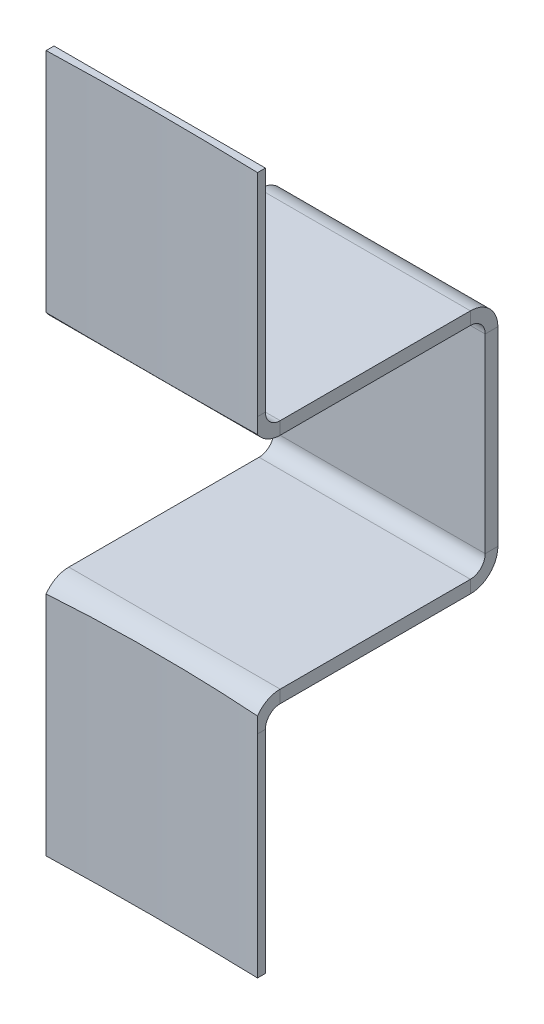
ISO-10303-21;
HEADER;
FILE_DESCRIPTION(('STEP AP214'),'2;1');
FILE_NAME('part.step','',(''),(''),'','','');
FILE_SCHEMA(('AUTOMOTIVE_DESIGN { 1 0 10303 214 1 1 1 1 }'));
ENDSEC;
DATA;
#1=APPLICATION_CONTEXT('core data for automotive mechanical design processes');
#2=APPLICATION_PROTOCOL_DEFINITION('international standard','automotive_design',2000,#1);
#3=PRODUCT_CONTEXT('',#1,'mechanical');
#4=PRODUCT('Part','Part','',(#3));
#5=PRODUCT_RELATED_PRODUCT_CATEGORY('part','',(#4));
#6=PRODUCT_DEFINITION_FORMATION('','',#4);
#7=PRODUCT_DEFINITION_CONTEXT('part definition',#1,'design');
#8=PRODUCT_DEFINITION('design','',#6,#7);
#9=PRODUCT_DEFINITION_SHAPE('','',#8);
#10=(LENGTH_UNIT() NAMED_UNIT(*) SI_UNIT(.MILLI.,.METRE.));
#11=(NAMED_UNIT(*) PLANE_ANGLE_UNIT() SI_UNIT($,.RADIAN.));
#12=(NAMED_UNIT(*) SI_UNIT($,.STERADIAN.) SOLID_ANGLE_UNIT());
#13=UNCERTAINTY_MEASURE_WITH_UNIT(LENGTH_MEASURE(1.E-05),#10,'distance_accuracy_value','');
#14=(GEOMETRIC_REPRESENTATION_CONTEXT(3) GLOBAL_UNCERTAINTY_ASSIGNED_CONTEXT((#13)) GLOBAL_UNIT_ASSIGNED_CONTEXT((#10,
#11,#12)) REPRESENTATION_CONTEXT('',''));
#15=CARTESIAN_POINT('',(0.,0.,0.));
#16=DIRECTION('',(0.,0.,1.));
#17=DIRECTION('',(1.,0.,0.));
#18=AXIS2_PLACEMENT_3D('',#15,#16,#17);
#19=CARTESIAN_POINT('',(0.,0.,0.));
#20=DIRECTION('',(0.,1.,0.));
#21=DIRECTION('',(0.,0.,1.));
#22=AXIS2_PLACEMENT_3D('',#19,#20,#21);
#23=PLANE('',#22);
#24=CARTESIAN_POINT('',(0.,0.,169.599));
#25=DIRECTION('',(0.,1.,0.));
#26=DIRECTION('',(0.,0.,1.));
#27=AXIS2_PLACEMENT_3D('',#24,#25,#26);
#28=CIRCLE('',#27,169.6);
#29=CARTESIAN_POINT('',(5.,0.,0.0727188516187749));
#30=VERTEX_POINT('',#29);
#31=CARTESIAN_POINT('',(-5.,0.,0.0727188516187749));
#32=VERTEX_POINT('',#31);
#33=EDGE_CURVE('E209',#30,#32,#28,.T.);
#34=ORIENTED_EDGE('',*,*,#33,.F.);
#35=DIRECTION('',(0.,0.,-1.));
#36=VECTOR('',#35,1.);
#37=CARTESIAN_POINT('',(5.,0.,-0.3));
#38=LINE('',#37,#36);
#39=CARTESIAN_POINT('',(5.,0.,-0.3));
#40=VERTEX_POINT('',#39);
#41=EDGE_CURVE('E290',#30,#40,#38,.T.);
#42=ORIENTED_EDGE('',*,*,#41,.T.);
#43=DIRECTION('',(-1.,0.,0.));
#44=VECTOR('',#43,1.);
#45=CARTESIAN_POINT('',(-5.,0.,-0.3));
#46=LINE('',#45,#44);
#47=CARTESIAN_POINT('',(-5.,0.,-0.3));
#48=VERTEX_POINT('',#47);
#49=EDGE_CURVE('E293',#40,#48,#46,.T.);
#50=ORIENTED_EDGE('',*,*,#49,.T.);
#51=DIRECTION('',(0.,0.,1.));
#52=VECTOR('',#51,1.);
#53=CARTESIAN_POINT('',(-5.,0.,-0.3));
#54=LINE('',#53,#52);
#55=EDGE_CURVE('E294',#48,#32,#54,.T.);
#56=ORIENTED_EDGE('',*,*,#55,.T.);
#57=EDGE_LOOP('',(#34,#42,#50,#56));
#58=FACE_BOUND('',#57,.T.);
#59=ADVANCED_FACE('F42',(#58),#23,.T.);
#60=CARTESIAN_POINT('',(0.,-33.,0.));
#61=DIRECTION('',(0.,1.,0.));
#62=DIRECTION('',(0.,0.,1.));
#63=AXIS2_PLACEMENT_3D('',#60,#61,#62);
#64=PLANE('',#63);
#65=DIRECTION('',(0.,0.,-1.));
#66=VECTOR('',#65,1.);
#67=CARTESIAN_POINT('',(5.,-33.,-0.300000000000001));
#68=LINE('',#67,#66);
#69=CARTESIAN_POINT('',(5.,-33.,0.0727188516187749));
#70=VERTEX_POINT('',#69);
#71=CARTESIAN_POINT('',(5.,-33.,-0.300000000000001));
#72=VERTEX_POINT('',#71);
#73=EDGE_CURVE('E206',#70,#72,#68,.T.);
#74=ORIENTED_EDGE('',*,*,#73,.F.);
#75=CARTESIAN_POINT('',(0.,-33.,169.599));
#76=DIRECTION('',(0.,1.,0.));
#77=DIRECTION('',(0.,0.,1.));
#78=AXIS2_PLACEMENT_3D('',#75,#76,#77);
#79=CIRCLE('',#78,169.6);
#80=CARTESIAN_POINT('',(-5.,-33.,0.0727188516187749));
#81=VERTEX_POINT('',#80);
#82=EDGE_CURVE('E65',#70,#81,#79,.T.);
#83=ORIENTED_EDGE('',*,*,#82,.T.);
#84=DIRECTION('',(0.,0.,1.));
#85=VECTOR('',#84,1.);
#86=CARTESIAN_POINT('',(-5.,-33.,-0.300000000000001));
#87=LINE('',#86,#85);
#88=CARTESIAN_POINT('',(-5.,-33.,-0.300000000000001));
#89=VERTEX_POINT('',#88);
#90=EDGE_CURVE('E204',#89,#81,#87,.T.);
#91=ORIENTED_EDGE('',*,*,#90,.F.);
#92=DIRECTION('',(-1.,0.,0.));
#93=VECTOR('',#92,1.);
#94=CARTESIAN_POINT('',(-5.,-33.,-0.300000000000001));
#95=LINE('',#94,#93);
#96=EDGE_CURVE('E50',#72,#89,#95,.T.);
#97=ORIENTED_EDGE('',*,*,#96,.F.);
#98=EDGE_LOOP('',(#74,#83,#91,#97));
#99=FACE_BOUND('',#98,.T.);
#100=ADVANCED_FACE('F202',(#99),#64,.F.);
#101=CARTESIAN_POINT('',(-5.,0.,-0.3));
#102=DIRECTION('',(1.,0.,0.));
#103=DIRECTION('',(0.,0.,-1.));
#104=AXIS2_PLACEMENT_3D('',#101,#102,#103);
#105=PLANE('',#104);
#106=DIRECTION('',(0.,0.,1.));
#107=VECTOR('',#106,1.);
#108=CARTESIAN_POINT('',(-5.,-9.99999999999999,-0.300000000000001));
#109=LINE('',#108,#107);
#110=CARTESIAN_POINT('',(-5.,-9.99999999999999,-0.300000000000001));
#111=VERTEX_POINT('',#110);
#112=CARTESIAN_POINT('',(-5.,-9.99999999999999,0.0727188516187749));
#113=VERTEX_POINT('',#112);
#114=EDGE_CURVE('E299',#111,#113,#109,.T.);
#115=ORIENTED_EDGE('',*,*,#114,.T.);
#116=DIRECTION('',(0.,1.,0.));
#117=VECTOR('',#116,1.);
#118=CARTESIAN_POINT('',(-5.,-33.,0.0727188516187749));
#119=LINE('',#118,#117);
#120=EDGE_CURVE('E609',#113,#32,#119,.T.);
#121=ORIENTED_EDGE('',*,*,#120,.T.);
#122=ORIENTED_EDGE('',*,*,#55,.F.);
#123=DIRECTION('',(0.,-1.,0.));
#124=VECTOR('',#123,1.);
#125=CARTESIAN_POINT('',(-5.,0.,-0.3));
#126=LINE('',#125,#124);
#127=EDGE_CURVE('E364',#48,#111,#126,.T.);
#128=ORIENTED_EDGE('',*,*,#127,.T.);
#129=EDGE_LOOP('',(#115,#121,#122,#128));
#130=FACE_BOUND('',#129,.T.);
#131=ADVANCED_FACE('F428',(#130),#105,.F.);
#132=CARTESIAN_POINT('',(5.,0.,-0.3));
#133=DIRECTION('',(-1.,0.,0.));
#134=DIRECTION('',(0.,0.,1.));
#135=AXIS2_PLACEMENT_3D('',#132,#133,#134);
#136=PLANE('',#135);
#137=ORIENTED_EDGE('',*,*,#41,.F.);
#138=DIRECTION('',(0.,1.,0.));
#139=VECTOR('',#138,1.);
#140=CARTESIAN_POINT('',(5.,-33.,0.0727188516187749));
#141=LINE('',#140,#139);
#142=CARTESIAN_POINT('',(5.,-9.99999999999999,0.0727188516187749));
#143=VERTEX_POINT('',#142);
#144=EDGE_CURVE('E518',#30,#143,#141,.F.);
#145=ORIENTED_EDGE('',*,*,#144,.T.);
#146=DIRECTION('',(0.,0.,-1.));
#147=VECTOR('',#146,1.);
#148=CARTESIAN_POINT('',(5.,-9.99999999999999,-0.300000000000001));
#149=LINE('',#148,#147);
#150=CARTESIAN_POINT('',(5.,-9.99999999999999,-0.300000000000001));
#151=VERTEX_POINT('',#150);
#152=EDGE_CURVE('E295',#143,#151,#149,.T.);
#153=ORIENTED_EDGE('',*,*,#152,.T.);
#154=DIRECTION('',(0.,-1.,0.));
#155=VECTOR('',#154,1.);
#156=CARTESIAN_POINT('',(5.,0.,-0.3));
#157=LINE('',#156,#155);
#158=EDGE_CURVE('E298',#40,#151,#157,.T.);
#159=ORIENTED_EDGE('',*,*,#158,.F.);
#160=EDGE_LOOP('',(#137,#145,#153,#159));
#161=FACE_BOUND('',#160,.T.);
#162=ADVANCED_FACE('F504',(#161),#136,.F.);
#163=CARTESIAN_POINT('',(-5.,0.,-0.3));
#164=DIRECTION('',(0.,0.,1.));
#165=DIRECTION('',(0.,-1.,0.));
#166=AXIS2_PLACEMENT_3D('',#163,#164,#165);
#167=PLANE('',#166);
#168=DIRECTION('',(-1.,0.,0.));
#169=VECTOR('',#168,1.);
#170=CARTESIAN_POINT('',(-5.,-9.99999999999999,-0.300000000000001));
#171=LINE('',#170,#169);
#172=EDGE_CURVE('E303',#151,#111,#171,.T.);
#173=ORIENTED_EDGE('',*,*,#172,.T.);
#174=ORIENTED_EDGE('',*,*,#127,.F.);
#175=ORIENTED_EDGE('',*,*,#49,.F.);
#176=ORIENTED_EDGE('',*,*,#158,.T.);
#177=EDGE_LOOP('',(#173,#174,#175,#176));
#178=FACE_BOUND('',#177,.T.);
#179=ADVANCED_FACE('F522',(#178),#167,.F.);
#180=CARTESIAN_POINT('',(-5.,-9.99999999999999,-0.300000000000001));
#181=DIRECTION('',(1.,0.,0.));
#182=DIRECTION('',(0.,0.,-1.));
#183=AXIS2_PLACEMENT_3D('',#180,#181,#182);
#184=PLANE('',#183);
#185=CARTESIAN_POINT('',(-5.,-10.,-1.));
#186=DIRECTION('',(1.,0.,0.));
#187=DIRECTION('',(0.,0.,1.));
#188=AXIS2_PLACEMENT_3D('',#185,#186,#187);
#189=CIRCLE('',#188,1.3);
#190=CARTESIAN_POINT('',(-5.,-10.7343529569503,0.0727188516187749));
#191=VERTEX_POINT('',#190);
#192=CARTESIAN_POINT('',(-5.,-11.3,-1.00000000000001));
#193=VERTEX_POINT('',#192);
#194=EDGE_CURVE('E230',#191,#193,#189,.T.);
#195=ORIENTED_EDGE('',*,*,#194,.F.);
#196=DIRECTION('',(0.,1.,0.));
#197=VECTOR('',#196,1.);
#198=CARTESIAN_POINT('',(-5.,-33.,0.0727188516187749));
#199=LINE('',#198,#197);
#200=EDGE_CURVE('E440',#191,#113,#199,.T.);
#201=ORIENTED_EDGE('',*,*,#200,.T.);
#202=ORIENTED_EDGE('',*,*,#114,.F.);
#203=CARTESIAN_POINT('',(-5.,-10.,-1.));
#204=DIRECTION('',(1.,0.,0.));
#205=DIRECTION('',(0.,0.,1.));
#206=AXIS2_PLACEMENT_3D('',#203,#204,#205);
#207=CIRCLE('',#206,0.700000000000001);
#208=CARTESIAN_POINT('',(-5.,-10.7,-1.00000000000001));
#209=VERTEX_POINT('',#208);
#210=EDGE_CURVE('E368',#111,#209,#207,.T.);
#211=ORIENTED_EDGE('',*,*,#210,.T.);
#212=DIRECTION('',(0.,-1.,0.));
#213=VECTOR('',#212,1.);
#214=CARTESIAN_POINT('',(-5.,-10.7,-1.00000000000001));
#215=LINE('',#214,#213);
#216=EDGE_CURVE('E534',#209,#193,#215,.T.);
#217=ORIENTED_EDGE('',*,*,#216,.T.);
#218=EDGE_LOOP('',(#195,#201,#202,#211,#217));
#219=FACE_BOUND('',#218,.T.);
#220=ADVANCED_FACE('F448',(#219),#184,.F.);
#221=CARTESIAN_POINT('',(0.,-10.,-1.));
#222=DIRECTION('',(1.,0.,0.));
#223=DIRECTION('',(0.,0.,-1.));
#224=AXIS2_PLACEMENT_3D('',#221,#222,#223);
#225=CYLINDRICAL_SURFACE('',#224,1.3);
#226=CARTESIAN_POINT('',(5.,-10.,-1.));
#227=DIRECTION('',(1.,0.,0.));
#228=DIRECTION('',(0.,0.,1.));
#229=AXIS2_PLACEMENT_3D('',#226,#227,#228);
#230=CIRCLE('',#229,1.3);
#231=CARTESIAN_POINT('',(5.,-10.7343529569503,0.0727188516187749));
#232=VERTEX_POINT('',#231);
#233=CARTESIAN_POINT('',(5.,-11.3,-1.00000000000001));
#234=VERTEX_POINT('',#233);
#235=EDGE_CURVE('E229',#232,#234,#230,.T.);
#236=ORIENTED_EDGE('',*,*,#235,.F.);
#237=CARTESIAN_POINT('',(5.,-10.7343529569503,0.0727188516187749));
#238=CARTESIAN_POINT('',(4.56710657150074,-10.7529223545076,0.0599507829004519));
#239=CARTESIAN_POINT('',(4.13403927755849,-10.7682262464902,0.0488378920569281));
#240=CARTESIAN_POINT('',(3.48433641418812,-10.7871174579659,0.0346573580335505));
#241=CARTESIAN_POINT('',(3.26778670418943,-10.7927365126097,0.0303458080338849));
#242=CARTESIAN_POINT('',(2.83464152802516,-10.8027605156565,0.0225519574346682));
#243=CARTESIAN_POINT('',(2.6180460611939,-10.807165444975,0.0190696698702353));
#244=CARTESIAN_POINT('',(1.78491533421112,-10.8219574039432,0.00727192238790079));
#245=CARTESIAN_POINT('',(1.16826225589085,-10.8283747085537,0.00190258279581291));
#246=CARTESIAN_POINT('',(-0.0651044875729709,-10.8331981860363,-0.00210871445944375));
#247=CARTESIAN_POINT('',(-0.681818153598923,-10.8316042164473,-0.000750552490463859));
#248=CARTESIAN_POINT('',(-1.60707138051038,-10.8229836608874,0.0063333804057084));
#249=CARTESIAN_POINT('',(-1.91566258517029,-10.8190686160109,0.00953846242033991));
#250=CARTESIAN_POINT('',(-2.53278542991408,-10.8089910077911,0.0176324407112478));
#251=CARTESIAN_POINT('',(-2.84131707032667,-10.8028284572274,0.0225213274133516));
#252=CARTESIAN_POINT('',(-3.45828794792507,-10.7880189099031,0.0339816884898349));
#253=CARTESIAN_POINT('',(-3.76672718593358,-10.7793719359627,0.040553147409192));
#254=CARTESIAN_POINT('',(-4.38347492480908,-10.7591596553084,0.05537637003732));
#255=CARTESIAN_POINT('',(-4.69178342303212,-10.7475942921546,0.0636281662421999));
#256=CARTESIAN_POINT('',(-5.,-10.7343529569504,0.0727188516187486));
#257=B_SPLINE_CURVE_WITH_KNOTS('',3,(#237,#238,#239,#240,#241,#242,#243,#244,#245,#246,#247,
#248,#249,#250,#251,#252,#253,#254,#255,#256),.UNSPECIFIED.,.F.,.F.,(4,2,2,2,2,2,2,2,2,4),(0.,
1.30040062071421,1.95039151468905,2.60039262515101,4.45041805959426,6.30047639232974,
7.22636385438622,8.15224605190095,9.07811974516451,10.0040113456367),.UNSPECIFIED.);
#258=EDGE_CURVE('E57',#232,#191,#257,.T.);
#259=ORIENTED_EDGE('',*,*,#258,.T.);
#260=ORIENTED_EDGE('',*,*,#194,.T.);
#261=DIRECTION('',(1.,0.,0.));
#262=VECTOR('',#261,1.);
#263=CARTESIAN_POINT('',(-5.,-11.3,-1.00000000000001));
#264=LINE('',#263,#262);
#265=EDGE_CURVE('E225',#193,#234,#264,.T.);
#266=ORIENTED_EDGE('',*,*,#265,.T.);
#267=EDGE_LOOP('',(#236,#259,#260,#266));
#268=FACE_BOUND('',#267,.T.);
#269=ADVANCED_FACE('F442',(#268),#225,.T.);
#270=CARTESIAN_POINT('',(5.,-9.99999999999999,-0.300000000000001));
#271=DIRECTION('',(-1.,0.,0.));
#272=DIRECTION('',(0.,0.,1.));
#273=AXIS2_PLACEMENT_3D('',#270,#271,#272);
#274=PLANE('',#273);
#275=ORIENTED_EDGE('',*,*,#152,.F.);
#276=DIRECTION('',(0.,1.,0.));
#277=VECTOR('',#276,1.);
#278=CARTESIAN_POINT('',(5.,-33.,0.0727188516187749));
#279=LINE('',#278,#277);
#280=EDGE_CURVE('E197',#143,#232,#279,.F.);
#281=ORIENTED_EDGE('',*,*,#280,.T.);
#282=ORIENTED_EDGE('',*,*,#235,.T.);
#283=DIRECTION('',(0.,1.,0.));
#284=VECTOR('',#283,1.);
#285=CARTESIAN_POINT('',(5.,-10.7,-1.00000000000001));
#286=LINE('',#285,#284);
#287=CARTESIAN_POINT('',(5.,-10.7,-1.00000000000001));
#288=VERTEX_POINT('',#287);
#289=EDGE_CURVE('E233',#234,#288,#286,.T.);
#290=ORIENTED_EDGE('',*,*,#289,.T.);
#291=CARTESIAN_POINT('',(5.,-10.,-1.));
#292=DIRECTION('',(1.,0.,0.));
#293=DIRECTION('',(0.,0.,1.));
#294=AXIS2_PLACEMENT_3D('',#291,#292,#293);
#295=CIRCLE('',#294,0.700000000000001);
#296=EDGE_CURVE('E307',#151,#288,#295,.T.);
#297=ORIENTED_EDGE('',*,*,#296,.F.);
#298=EDGE_LOOP('',(#275,#281,#282,#290,#297));
#299=FACE_BOUND('',#298,.T.);
#300=ADVANCED_FACE('F447',(#299),#274,.F.);
#301=CARTESIAN_POINT('',(0.,-10.,-1.));
#302=DIRECTION('',(1.,0.,0.));
#303=DIRECTION('',(0.,0.,-1.));
#304=AXIS2_PLACEMENT_3D('',#301,#302,#303);
#305=CYLINDRICAL_SURFACE('',#304,0.700000000000001);
#306=DIRECTION('',(-1.,0.,0.));
#307=VECTOR('',#306,1.);
#308=CARTESIAN_POINT('',(-5.,-10.7,-1.00000000000001));
#309=LINE('',#308,#307);
#310=EDGE_CURVE('E311',#288,#209,#309,.T.);
#311=ORIENTED_EDGE('',*,*,#310,.T.);
#312=ORIENTED_EDGE('',*,*,#210,.F.);
#313=ORIENTED_EDGE('',*,*,#172,.F.);
#314=ORIENTED_EDGE('',*,*,#296,.T.);
#315=EDGE_LOOP('',(#311,#312,#313,#314));
#316=FACE_BOUND('',#315,.T.);
#317=ADVANCED_FACE('F627',(#316),#305,.F.);
#318=CARTESIAN_POINT('',(-5.,-10.7,-1.00000000000001));
#319=DIRECTION('',(1.,0.,0.));
#320=DIRECTION('',(0.,0.,-1.));
#321=AXIS2_PLACEMENT_3D('',#318,#319,#320);
#322=PLANE('',#321);
#323=DIRECTION('',(0.,0.,-1.));
#324=VECTOR('',#323,1.);
#325=CARTESIAN_POINT('',(-5.,-11.3,-1.00000000000001));
#326=LINE('',#325,#324);
#327=CARTESIAN_POINT('',(-5.,-11.3,-9.99999999999999));
#328=VERTEX_POINT('',#327);
#329=EDGE_CURVE('E239',#193,#328,#326,.T.);
#330=ORIENTED_EDGE('',*,*,#329,.F.);
#331=ORIENTED_EDGE('',*,*,#216,.F.);
#332=DIRECTION('',(0.,0.,-1.));
#333=VECTOR('',#332,1.);
#334=CARTESIAN_POINT('',(-5.,-10.7,-1.00000000000001));
#335=LINE('',#334,#333);
#336=CARTESIAN_POINT('',(-5.,-10.7,-9.99999999999999));
#337=VERTEX_POINT('',#336);
#338=EDGE_CURVE('E372',#209,#337,#335,.T.);
#339=ORIENTED_EDGE('',*,*,#338,.T.);
#340=DIRECTION('',(0.,-1.,0.));
#341=VECTOR('',#340,1.);
#342=CARTESIAN_POINT('',(-5.,-10.7,-9.99999999999999));
#343=LINE('',#342,#341);
#344=EDGE_CURVE('E543',#337,#328,#343,.T.);
#345=ORIENTED_EDGE('',*,*,#344,.T.);
#346=EDGE_LOOP('',(#330,#331,#339,#345));
#347=FACE_BOUND('',#346,.T.);
#348=ADVANCED_FACE('F455',(#347),#322,.F.);
#349=CARTESIAN_POINT('',(-5.,-11.3,-1.00000000000001));
#350=DIRECTION('',(0.,1.,0.));
#351=DIRECTION('',(0.,0.,1.));
#352=AXIS2_PLACEMENT_3D('',#349,#350,#351);
#353=PLANE('',#352);
#354=DIRECTION('',(0.,0.,-1.));
#355=VECTOR('',#354,1.);
#356=CARTESIAN_POINT('',(5.,-11.3,-1.00000000000001));
#357=LINE('',#356,#355);
#358=CARTESIAN_POINT('',(5.,-11.3,-9.99999999999999));
#359=VERTEX_POINT('',#358);
#360=EDGE_CURVE('E238',#234,#359,#357,.T.);
#361=ORIENTED_EDGE('',*,*,#360,.F.);
#362=ORIENTED_EDGE('',*,*,#265,.F.);
#363=ORIENTED_EDGE('',*,*,#329,.T.);
#364=DIRECTION('',(1.,0.,0.));
#365=VECTOR('',#364,1.);
#366=CARTESIAN_POINT('',(-5.,-11.3,-9.99999999999999));
#367=LINE('',#366,#365);
#368=EDGE_CURVE('E234',#328,#359,#367,.T.);
#369=ORIENTED_EDGE('',*,*,#368,.T.);
#370=EDGE_LOOP('',(#361,#362,#363,#369));
#371=FACE_BOUND('',#370,.T.);
#372=ADVANCED_FACE('F451',(#371),#353,.F.);
#373=CARTESIAN_POINT('',(5.,-10.7,-1.00000000000001));
#374=DIRECTION('',(-1.,0.,0.));
#375=DIRECTION('',(0.,0.,1.));
#376=AXIS2_PLACEMENT_3D('',#373,#374,#375);
#377=PLANE('',#376);
#378=DIRECTION('',(0.,0.,-1.));
#379=VECTOR('',#378,1.);
#380=CARTESIAN_POINT('',(5.,-10.7,-1.00000000000001));
#381=LINE('',#380,#379);
#382=CARTESIAN_POINT('',(5.,-10.7,-9.99999999999999));
#383=VERTEX_POINT('',#382);
#384=EDGE_CURVE('E315',#288,#383,#381,.T.);
#385=ORIENTED_EDGE('',*,*,#384,.F.);
#386=ORIENTED_EDGE('',*,*,#289,.F.);
#387=ORIENTED_EDGE('',*,*,#360,.T.);
#388=DIRECTION('',(0.,1.,0.));
#389=VECTOR('',#388,1.);
#390=CARTESIAN_POINT('',(5.,-10.7,-9.99999999999999));
#391=LINE('',#390,#389);
#392=EDGE_CURVE('E243',#359,#383,#391,.T.);
#393=ORIENTED_EDGE('',*,*,#392,.T.);
#394=EDGE_LOOP('',(#385,#386,#387,#393));
#395=FACE_BOUND('',#394,.T.);
#396=ADVANCED_FACE('F454',(#395),#377,.F.);
#397=CARTESIAN_POINT('',(-5.,-10.7,-1.00000000000001));
#398=DIRECTION('',(0.,-1.,0.));
#399=DIRECTION('',(0.,0.,-1.));
#400=AXIS2_PLACEMENT_3D('',#397,#398,#399);
#401=PLANE('',#400);
#402=DIRECTION('',(-1.,0.,0.));
#403=VECTOR('',#402,1.);
#404=CARTESIAN_POINT('',(-5.,-10.7,-9.99999999999999));
#405=LINE('',#404,#403);
#406=EDGE_CURVE('E319',#383,#337,#405,.T.);
#407=ORIENTED_EDGE('',*,*,#406,.T.);
#408=ORIENTED_EDGE('',*,*,#338,.F.);
#409=ORIENTED_EDGE('',*,*,#310,.F.);
#410=ORIENTED_EDGE('',*,*,#384,.T.);
#411=EDGE_LOOP('',(#407,#408,#409,#410));
#412=FACE_BOUND('',#411,.T.);
#413=ADVANCED_FACE('F629',(#412),#401,.F.);
#414=CARTESIAN_POINT('',(-5.,-10.7,-9.99999999999999));
#415=DIRECTION('',(1.,0.,0.));
#416=DIRECTION('',(0.,0.,-1.));
#417=AXIS2_PLACEMENT_3D('',#414,#415,#416);
#418=PLANE('',#417);
#419=CARTESIAN_POINT('',(-5.,-12.,-10.));
#420=DIRECTION('',(-1.,0.,0.));
#421=DIRECTION('',(0.,1.,0.));
#422=AXIS2_PLACEMENT_3D('',#419,#420,#421);
#423=CIRCLE('',#422,0.699999999999999);
#424=CARTESIAN_POINT('',(-5.,-12.,-10.7));
#425=VERTEX_POINT('',#424);
#426=EDGE_CURVE('E249',#328,#425,#423,.T.);
#427=ORIENTED_EDGE('',*,*,#426,.F.);
#428=ORIENTED_EDGE('',*,*,#344,.F.);
#429=CARTESIAN_POINT('',(-5.,-12.,-10.));
#430=DIRECTION('',(-1.,0.,0.));
#431=DIRECTION('',(0.,1.,0.));
#432=AXIS2_PLACEMENT_3D('',#429,#430,#431);
#433=CIRCLE('',#432,1.3);
#434=CARTESIAN_POINT('',(-5.,-12.,-11.3));
#435=VERTEX_POINT('',#434);
#436=EDGE_CURVE('E376',#337,#435,#433,.T.);
#437=ORIENTED_EDGE('',*,*,#436,.T.);
#438=DIRECTION('',(0.,0.,1.));
#439=VECTOR('',#438,1.);
#440=CARTESIAN_POINT('',(-5.,-12.,-11.3));
#441=LINE('',#440,#439);
#442=EDGE_CURVE('E553',#435,#425,#441,.T.);
#443=ORIENTED_EDGE('',*,*,#442,.T.);
#444=EDGE_LOOP('',(#427,#428,#437,#443));
#445=FACE_BOUND('',#444,.T.);
#446=ADVANCED_FACE('F461',(#445),#418,.F.);
#447=CARTESIAN_POINT('',(0.,-12.,-10.));
#448=DIRECTION('',(-1.,0.,0.));
#449=DIRECTION('',(0.,0.,1.));
#450=AXIS2_PLACEMENT_3D('',#447,#448,#449);
#451=CYLINDRICAL_SURFACE('',#450,0.699999999999999);
#452=CARTESIAN_POINT('',(5.,-12.,-10.));
#453=DIRECTION('',(-1.,0.,0.));
#454=DIRECTION('',(0.,1.,0.));
#455=AXIS2_PLACEMENT_3D('',#452,#453,#454);
#456=CIRCLE('',#455,0.699999999999999);
#457=CARTESIAN_POINT('',(5.,-12.,-10.7));
#458=VERTEX_POINT('',#457);
#459=EDGE_CURVE('E248',#359,#458,#456,.T.);
#460=ORIENTED_EDGE('',*,*,#459,.F.);
#461=ORIENTED_EDGE('',*,*,#368,.F.);
#462=ORIENTED_EDGE('',*,*,#426,.T.);
#463=DIRECTION('',(1.,0.,0.));
#464=VECTOR('',#463,1.);
#465=CARTESIAN_POINT('',(-5.,-12.,-10.7));
#466=LINE('',#465,#464);
#467=EDGE_CURVE('E244',#425,#458,#466,.T.);
#468=ORIENTED_EDGE('',*,*,#467,.T.);
#469=EDGE_LOOP('',(#460,#461,#462,#468));
#470=FACE_BOUND('',#469,.T.);
#471=ADVANCED_FACE('F457',(#470),#451,.F.);
#472=CARTESIAN_POINT('',(5.,-10.7,-9.99999999999999));
#473=DIRECTION('',(-1.,0.,0.));
#474=DIRECTION('',(0.,0.,1.));
#475=AXIS2_PLACEMENT_3D('',#472,#473,#474);
#476=PLANE('',#475);
#477=CARTESIAN_POINT('',(5.,-12.,-10.));
#478=DIRECTION('',(-1.,0.,0.));
#479=DIRECTION('',(0.,1.,0.));
#480=AXIS2_PLACEMENT_3D('',#477,#478,#479);
#481=CIRCLE('',#480,1.3);
#482=CARTESIAN_POINT('',(5.,-12.,-11.3));
#483=VERTEX_POINT('',#482);
#484=EDGE_CURVE('E323',#383,#483,#481,.T.);
#485=ORIENTED_EDGE('',*,*,#484,.F.);
#486=ORIENTED_EDGE('',*,*,#392,.F.);
#487=ORIENTED_EDGE('',*,*,#459,.T.);
#488=DIRECTION('',(0.,0.,-1.));
#489=VECTOR('',#488,1.);
#490=CARTESIAN_POINT('',(5.,-12.,-11.3));
#491=LINE('',#490,#489);
#492=EDGE_CURVE('E253',#458,#483,#491,.T.);
#493=ORIENTED_EDGE('',*,*,#492,.T.);
#494=EDGE_LOOP('',(#485,#486,#487,#493));
#495=FACE_BOUND('',#494,.T.);
#496=ADVANCED_FACE('F460',(#495),#476,.F.);
#497=CARTESIAN_POINT('',(0.,-12.,-10.));
#498=DIRECTION('',(-1.,0.,0.));
#499=DIRECTION('',(0.,0.,1.));
#500=AXIS2_PLACEMENT_3D('',#497,#498,#499);
#501=CYLINDRICAL_SURFACE('',#500,1.3);
#502=DIRECTION('',(-1.,0.,0.));
#503=VECTOR('',#502,1.);
#504=CARTESIAN_POINT('',(-5.,-12.,-11.3));
#505=LINE('',#504,#503);
#506=EDGE_CURVE('E327',#483,#435,#505,.T.);
#507=ORIENTED_EDGE('',*,*,#506,.T.);
#508=ORIENTED_EDGE('',*,*,#436,.F.);
#509=ORIENTED_EDGE('',*,*,#406,.F.);
#510=ORIENTED_EDGE('',*,*,#484,.T.);
#511=EDGE_LOOP('',(#507,#508,#509,#510));
#512=FACE_BOUND('',#511,.T.);
#513=ADVANCED_FACE('F638',(#512),#501,.T.);
#514=CARTESIAN_POINT('',(-5.,-12.,-11.3));
#515=DIRECTION('',(1.,0.,0.));
#516=DIRECTION('',(0.,0.,-1.));
#517=AXIS2_PLACEMENT_3D('',#514,#515,#516);
#518=PLANE('',#517);
#519=DIRECTION('',(0.,-1.,0.));
#520=VECTOR('',#519,1.);
#521=CARTESIAN_POINT('',(-5.,-12.,-10.7));
#522=LINE('',#521,#520);
#523=CARTESIAN_POINT('',(-5.,-21.,-10.7));
#524=VERTEX_POINT('',#523);
#525=EDGE_CURVE('E259',#425,#524,#522,.T.);
#526=ORIENTED_EDGE('',*,*,#525,.F.);
#527=ORIENTED_EDGE('',*,*,#442,.F.);
#528=DIRECTION('',(0.,-1.,0.));
#529=VECTOR('',#528,1.);
#530=CARTESIAN_POINT('',(-5.,-12.,-11.3));
#531=LINE('',#530,#529);
#532=CARTESIAN_POINT('',(-5.,-21.,-11.3));
#533=VERTEX_POINT('',#532);
#534=EDGE_CURVE('E380',#435,#533,#531,.T.);
#535=ORIENTED_EDGE('',*,*,#534,.T.);
#536=DIRECTION('',(0.,0.,1.));
#537=VECTOR('',#536,1.);
#538=CARTESIAN_POINT('',(-5.,-21.,-11.3));
#539=LINE('',#538,#537);
#540=EDGE_CURVE('E563',#533,#524,#539,.T.);
#541=ORIENTED_EDGE('',*,*,#540,.T.);
#542=EDGE_LOOP('',(#526,#527,#535,#541));
#543=FACE_BOUND('',#542,.T.);
#544=ADVANCED_FACE('F467',(#543),#518,.F.);
#545=CARTESIAN_POINT('',(-5.,-12.,-10.7));
#546=DIRECTION('',(0.,0.,-1.));
#547=DIRECTION('',(-1.,0.,0.));
#548=AXIS2_PLACEMENT_3D('',#545,#546,#547);
#549=PLANE('',#548);
#550=DIRECTION('',(0.,-1.,0.));
#551=VECTOR('',#550,1.);
#552=CARTESIAN_POINT('',(5.,-12.,-10.7));
#553=LINE('',#552,#551);
#554=CARTESIAN_POINT('',(5.,-21.,-10.7));
#555=VERTEX_POINT('',#554);
#556=EDGE_CURVE('E258',#458,#555,#553,.T.);
#557=ORIENTED_EDGE('',*,*,#556,.F.);
#558=ORIENTED_EDGE('',*,*,#467,.F.);
#559=ORIENTED_EDGE('',*,*,#525,.T.);
#560=DIRECTION('',(1.,0.,0.));
#561=VECTOR('',#560,1.);
#562=CARTESIAN_POINT('',(-5.,-21.,-10.7));
#563=LINE('',#562,#561);
#564=EDGE_CURVE('E254',#524,#555,#563,.T.);
#565=ORIENTED_EDGE('',*,*,#564,.T.);
#566=EDGE_LOOP('',(#557,#558,#559,#565));
#567=FACE_BOUND('',#566,.T.);
#568=ADVANCED_FACE('F463',(#567),#549,.F.);
#569=CARTESIAN_POINT('',(5.,-12.,-11.3));
#570=DIRECTION('',(-1.,0.,0.));
#571=DIRECTION('',(0.,0.,1.));
#572=AXIS2_PLACEMENT_3D('',#569,#570,#571);
#573=PLANE('',#572);
#574=DIRECTION('',(0.,-1.,0.));
#575=VECTOR('',#574,1.);
#576=CARTESIAN_POINT('',(5.,-12.,-11.3));
#577=LINE('',#576,#575);
#578=CARTESIAN_POINT('',(5.,-21.,-11.3));
#579=VERTEX_POINT('',#578);
#580=EDGE_CURVE('E331',#483,#579,#577,.T.);
#581=ORIENTED_EDGE('',*,*,#580,.F.);
#582=ORIENTED_EDGE('',*,*,#492,.F.);
#583=ORIENTED_EDGE('',*,*,#556,.T.);
#584=DIRECTION('',(0.,0.,-1.));
#585=VECTOR('',#584,1.);
#586=CARTESIAN_POINT('',(5.,-21.,-11.3));
#587=LINE('',#586,#585);
#588=EDGE_CURVE('E263',#555,#579,#587,.T.);
#589=ORIENTED_EDGE('',*,*,#588,.T.);
#590=EDGE_LOOP('',(#581,#582,#583,#589));
#591=FACE_BOUND('',#590,.T.);
#592=ADVANCED_FACE('F466',(#591),#573,.F.);
#593=CARTESIAN_POINT('',(-5.,-12.,-11.3));
#594=DIRECTION('',(0.,0.,1.));
#595=DIRECTION('',(1.,0.,0.));
#596=AXIS2_PLACEMENT_3D('',#593,#594,#595);
#597=PLANE('',#596);
#598=DIRECTION('',(-1.,0.,0.));
#599=VECTOR('',#598,1.);
#600=CARTESIAN_POINT('',(-5.,-21.,-11.3));
#601=LINE('',#600,#599);
#602=EDGE_CURVE('E335',#579,#533,#601,.T.);
#603=ORIENTED_EDGE('',*,*,#602,.T.);
#604=ORIENTED_EDGE('',*,*,#534,.F.);
#605=ORIENTED_EDGE('',*,*,#506,.F.);
#606=ORIENTED_EDGE('',*,*,#580,.T.);
#607=EDGE_LOOP('',(#603,#604,#605,#606));
#608=FACE_BOUND('',#607,.T.);
#609=ADVANCED_FACE('F646',(#608),#597,.F.);
#610=CARTESIAN_POINT('',(-5.,-21.,-11.3));
#611=DIRECTION('',(1.,0.,0.));
#612=DIRECTION('',(0.,0.,-1.));
#613=AXIS2_PLACEMENT_3D('',#610,#611,#612);
#614=PLANE('',#613);
#615=CARTESIAN_POINT('',(-5.,-21.,-10.));
#616=DIRECTION('',(-1.,0.,0.));
#617=DIRECTION('',(0.,0.,-1.));
#618=AXIS2_PLACEMENT_3D('',#615,#616,#617);
#619=CIRCLE('',#618,0.699999999999999);
#620=CARTESIAN_POINT('',(-5.,-21.7,-9.99999999999999));
#621=VERTEX_POINT('',#620);
#622=EDGE_CURVE('E269',#524,#621,#619,.T.);
#623=ORIENTED_EDGE('',*,*,#622,.F.);
#624=ORIENTED_EDGE('',*,*,#540,.F.);
#625=CARTESIAN_POINT('',(-5.,-21.,-10.));
#626=DIRECTION('',(-1.,0.,0.));
#627=DIRECTION('',(0.,0.,-1.));
#628=AXIS2_PLACEMENT_3D('',#625,#626,#627);
#629=CIRCLE('',#628,1.3);
#630=CARTESIAN_POINT('',(-5.,-22.3,-9.99999999999999));
#631=VERTEX_POINT('',#630);
#632=EDGE_CURVE('E384',#533,#631,#629,.T.);
#633=ORIENTED_EDGE('',*,*,#632,.T.);
#634=DIRECTION('',(0.,1.,0.));
#635=VECTOR('',#634,1.);
#636=CARTESIAN_POINT('',(-5.,-22.3,-9.99999999999999));
#637=LINE('',#636,#635);
#638=EDGE_CURVE('E573',#631,#621,#637,.T.);
#639=ORIENTED_EDGE('',*,*,#638,.T.);
#640=EDGE_LOOP('',(#623,#624,#633,#639));
#641=FACE_BOUND('',#640,.T.);
#642=ADVANCED_FACE('F472',(#641),#614,.F.);
#643=CARTESIAN_POINT('',(0.,-21.,-10.));
#644=DIRECTION('',(-1.,0.,0.));
#645=DIRECTION('',(0.,0.,1.));
#646=AXIS2_PLACEMENT_3D('',#643,#644,#645);
#647=CYLINDRICAL_SURFACE('',#646,0.699999999999999);
#648=CARTESIAN_POINT('',(5.,-21.,-10.));
#649=DIRECTION('',(-1.,0.,0.));
#650=DIRECTION('',(0.,0.,-1.));
#651=AXIS2_PLACEMENT_3D('',#648,#649,#650);
#652=CIRCLE('',#651,0.699999999999999);
#653=CARTESIAN_POINT('',(5.,-21.7,-9.99999999999999));
#654=VERTEX_POINT('',#653);
#655=EDGE_CURVE('E268',#555,#654,#652,.T.);
#656=ORIENTED_EDGE('',*,*,#655,.F.);
#657=ORIENTED_EDGE('',*,*,#564,.F.);
#658=ORIENTED_EDGE('',*,*,#622,.T.);
#659=DIRECTION('',(1.,0.,0.));
#660=VECTOR('',#659,1.);
#661=CARTESIAN_POINT('',(-5.,-21.7,-9.99999999999999));
#662=LINE('',#661,#660);
#663=EDGE_CURVE('E264',#621,#654,#662,.T.);
#664=ORIENTED_EDGE('',*,*,#663,.T.);
#665=EDGE_LOOP('',(#656,#657,#658,#664));
#666=FACE_BOUND('',#665,.T.);
#667=ADVANCED_FACE('F469',(#666),#647,.F.);
#668=CARTESIAN_POINT('',(5.,-21.,-11.3));
#669=DIRECTION('',(-1.,0.,0.));
#670=DIRECTION('',(0.,0.,1.));
#671=AXIS2_PLACEMENT_3D('',#668,#669,#670);
#672=PLANE('',#671);
#673=CARTESIAN_POINT('',(5.,-21.,-10.));
#674=DIRECTION('',(-1.,0.,0.));
#675=DIRECTION('',(0.,0.,-1.));
#676=AXIS2_PLACEMENT_3D('',#673,#674,#675);
#677=CIRCLE('',#676,1.3);
#678=CARTESIAN_POINT('',(5.,-22.3,-9.99999999999999));
#679=VERTEX_POINT('',#678);
#680=EDGE_CURVE('E339',#579,#679,#677,.T.);
#681=ORIENTED_EDGE('',*,*,#680,.F.);
#682=ORIENTED_EDGE('',*,*,#588,.F.);
#683=ORIENTED_EDGE('',*,*,#655,.T.);
#684=DIRECTION('',(0.,-1.,0.));
#685=VECTOR('',#684,1.);
#686=CARTESIAN_POINT('',(5.,-22.3,-9.99999999999999));
#687=LINE('',#686,#685);
#688=EDGE_CURVE('E273',#654,#679,#687,.T.);
#689=ORIENTED_EDGE('',*,*,#688,.T.);
#690=EDGE_LOOP('',(#681,#682,#683,#689));
#691=FACE_BOUND('',#690,.T.);
#692=ADVANCED_FACE('F471',(#691),#672,.F.);
#693=CARTESIAN_POINT('',(0.,-21.,-10.));
#694=DIRECTION('',(-1.,0.,0.));
#695=DIRECTION('',(0.,0.,1.));
#696=AXIS2_PLACEMENT_3D('',#693,#694,#695);
#697=CYLINDRICAL_SURFACE('',#696,1.3);
#698=DIRECTION('',(-1.,0.,0.));
#699=VECTOR('',#698,1.);
#700=CARTESIAN_POINT('',(-5.,-22.3,-9.99999999999999));
#701=LINE('',#700,#699);
#702=EDGE_CURVE('E343',#679,#631,#701,.T.);
#703=ORIENTED_EDGE('',*,*,#702,.T.);
#704=ORIENTED_EDGE('',*,*,#632,.F.);
#705=ORIENTED_EDGE('',*,*,#602,.F.);
#706=ORIENTED_EDGE('',*,*,#680,.T.);
#707=EDGE_LOOP('',(#703,#704,#705,#706));
#708=FACE_BOUND('',#707,.T.);
#709=ADVANCED_FACE('F486',(#708),#697,.T.);
#710=CARTESIAN_POINT('',(-5.,-22.3,-9.99999999999999));
#711=DIRECTION('',(1.,0.,0.));
#712=DIRECTION('',(0.,0.,-1.));
#713=AXIS2_PLACEMENT_3D('',#710,#711,#712);
#714=PLANE('',#713);
#715=DIRECTION('',(0.,0.,1.));
#716=VECTOR('',#715,1.);
#717=CARTESIAN_POINT('',(-5.,-21.7,-9.99999999999999));
#718=LINE('',#717,#716);
#719=CARTESIAN_POINT('',(-5.,-21.7,-1.00000000000001));
#720=VERTEX_POINT('',#719);
#721=EDGE_CURVE('E279',#621,#720,#718,.T.);
#722=ORIENTED_EDGE('',*,*,#721,.F.);
#723=ORIENTED_EDGE('',*,*,#638,.F.);
#724=DIRECTION('',(0.,0.,1.));
#725=VECTOR('',#724,1.);
#726=CARTESIAN_POINT('',(-5.,-22.3,-9.99999999999999));
#727=LINE('',#726,#725);
#728=CARTESIAN_POINT('',(-5.,-22.3,-1.00000000000001));
#729=VERTEX_POINT('',#728);
#730=EDGE_CURVE('E388',#631,#729,#727,.T.);
#731=ORIENTED_EDGE('',*,*,#730,.T.);
#732=DIRECTION('',(0.,1.,0.));
#733=VECTOR('',#732,1.);
#734=CARTESIAN_POINT('',(-5.,-22.3,-1.00000000000001));
#735=LINE('',#734,#733);
#736=EDGE_CURVE('E583',#729,#720,#735,.T.);
#737=ORIENTED_EDGE('',*,*,#736,.T.);
#738=EDGE_LOOP('',(#722,#723,#731,#737));
#739=FACE_BOUND('',#738,.T.);
#740=ADVANCED_FACE('F477',(#739),#714,.F.);
#741=CARTESIAN_POINT('',(-5.,-21.7,-9.99999999999999));
#742=DIRECTION('',(0.,-1.,0.));
#743=DIRECTION('',(0.,0.,-1.));
#744=AXIS2_PLACEMENT_3D('',#741,#742,#743);
#745=PLANE('',#744);
#746=DIRECTION('',(0.,0.,1.));
#747=VECTOR('',#746,1.);
#748=CARTESIAN_POINT('',(5.,-21.7,-9.99999999999999));
#749=LINE('',#748,#747);
#750=CARTESIAN_POINT('',(5.,-21.7,-1.00000000000001));
#751=VERTEX_POINT('',#750);
#752=EDGE_CURVE('E278',#654,#751,#749,.T.);
#753=ORIENTED_EDGE('',*,*,#752,.F.);
#754=ORIENTED_EDGE('',*,*,#663,.F.);
#755=ORIENTED_EDGE('',*,*,#721,.T.);
#756=DIRECTION('',(1.,0.,0.));
#757=VECTOR('',#756,1.);
#758=CARTESIAN_POINT('',(-5.,-21.7,-1.00000000000001));
#759=LINE('',#758,#757);
#760=EDGE_CURVE('E274',#720,#751,#759,.T.);
#761=ORIENTED_EDGE('',*,*,#760,.T.);
#762=EDGE_LOOP('',(#753,#754,#755,#761));
#763=FACE_BOUND('',#762,.T.);
#764=ADVANCED_FACE('F474',(#763),#745,.F.);
#765=CARTESIAN_POINT('',(5.,-22.3,-9.99999999999999));
#766=DIRECTION('',(-1.,0.,0.));
#767=DIRECTION('',(0.,0.,1.));
#768=AXIS2_PLACEMENT_3D('',#765,#766,#767);
#769=PLANE('',#768);
#770=DIRECTION('',(0.,0.,1.));
#771=VECTOR('',#770,1.);
#772=CARTESIAN_POINT('',(5.,-22.3,-9.99999999999999));
#773=LINE('',#772,#771);
#774=CARTESIAN_POINT('',(5.,-22.3,-1.00000000000001));
#775=VERTEX_POINT('',#774);
#776=EDGE_CURVE('E347',#679,#775,#773,.T.);
#777=ORIENTED_EDGE('',*,*,#776,.F.);
#778=ORIENTED_EDGE('',*,*,#688,.F.);
#779=ORIENTED_EDGE('',*,*,#752,.T.);
#780=DIRECTION('',(0.,-1.,0.));
#781=VECTOR('',#780,1.);
#782=CARTESIAN_POINT('',(5.,-22.3,-1.00000000000001));
#783=LINE('',#782,#781);
#784=EDGE_CURVE('E283',#751,#775,#783,.T.);
#785=ORIENTED_EDGE('',*,*,#784,.T.);
#786=EDGE_LOOP('',(#777,#778,#779,#785));
#787=FACE_BOUND('',#786,.T.);
#788=ADVANCED_FACE('F476',(#787),#769,.F.);
#789=CARTESIAN_POINT('',(-5.,-22.3,-9.99999999999999));
#790=DIRECTION('',(0.,1.,0.));
#791=DIRECTION('',(0.,0.,1.));
#792=AXIS2_PLACEMENT_3D('',#789,#790,#791);
#793=PLANE('',#792);
#794=DIRECTION('',(-1.,0.,0.));
#795=VECTOR('',#794,1.);
#796=CARTESIAN_POINT('',(-5.,-22.3,-1.00000000000001));
#797=LINE('',#796,#795);
#798=EDGE_CURVE('E351',#775,#729,#797,.T.);
#799=ORIENTED_EDGE('',*,*,#798,.T.);
#800=ORIENTED_EDGE('',*,*,#730,.F.);
#801=ORIENTED_EDGE('',*,*,#702,.F.);
#802=ORIENTED_EDGE('',*,*,#776,.T.);
#803=EDGE_LOOP('',(#799,#800,#801,#802));
#804=FACE_BOUND('',#803,.T.);
#805=ADVANCED_FACE('F483',(#804),#793,.F.);
#806=CARTESIAN_POINT('',(-5.,-22.3,-1.00000000000001));
#807=DIRECTION('',(1.,0.,0.));
#808=DIRECTION('',(0.,0.,-1.));
#809=AXIS2_PLACEMENT_3D('',#806,#807,#808);
#810=PLANE('',#809);
#811=DIRECTION('',(0.,0.,1.));
#812=VECTOR('',#811,1.);
#813=CARTESIAN_POINT('',(-5.,-23.,-0.3));
#814=LINE('',#813,#812);
#815=CARTESIAN_POINT('',(-5.,-23.,-0.299999999999997));
#816=VERTEX_POINT('',#815);
#817=CARTESIAN_POINT('',(-5.,-23.,0.0727188516187749));
#818=VERTEX_POINT('',#817);
#819=EDGE_CURVE('E593',#816,#818,#814,.T.);
#820=ORIENTED_EDGE('',*,*,#819,.T.);
#821=DIRECTION('',(0.,1.,0.));
#822=VECTOR('',#821,1.);
#823=CARTESIAN_POINT('',(-5.,-33.,0.0727188516187749));
#824=LINE('',#823,#822);
#825=CARTESIAN_POINT('',(-5.,-22.2656470430497,0.0727188516187749));
#826=VERTEX_POINT('',#825);
#827=EDGE_CURVE('E191',#818,#826,#824,.T.);
#828=ORIENTED_EDGE('',*,*,#827,.T.);
#829=CARTESIAN_POINT('',(-5.,-23.,-1.));
#830=DIRECTION('',(1.,0.,0.));
#831=DIRECTION('',(0.,1.,0.));
#832=AXIS2_PLACEMENT_3D('',#829,#830,#831);
#833=CIRCLE('',#832,1.3);
#834=EDGE_CURVE('E289',#720,#826,#833,.T.);
#835=ORIENTED_EDGE('',*,*,#834,.F.);
#836=ORIENTED_EDGE('',*,*,#736,.F.);
#837=CARTESIAN_POINT('',(-5.,-23.,-1.));
#838=DIRECTION('',(1.,0.,0.));
#839=DIRECTION('',(0.,1.,0.));
#840=AXIS2_PLACEMENT_3D('',#837,#838,#839);
#841=CIRCLE('',#840,0.700000000000003);
#842=EDGE_CURVE('E222',#729,#816,#841,.T.);
#843=ORIENTED_EDGE('',*,*,#842,.T.);
#844=EDGE_LOOP('',(#820,#828,#835,#836,#843));
#845=FACE_BOUND('',#844,.T.);
#846=ADVANCED_FACE('F601',(#845),#810,.F.);
#847=CARTESIAN_POINT('',(0.,-23.,-1.));
#848=DIRECTION('',(1.,0.,0.));
#849=DIRECTION('',(0.,0.,-1.));
#850=AXIS2_PLACEMENT_3D('',#847,#848,#849);
#851=CYLINDRICAL_SURFACE('',#850,1.3);
#852=ORIENTED_EDGE('',*,*,#834,.T.);
#853=CARTESIAN_POINT('',(-5.,-22.2656470430497,0.0727188516187749));
#854=CARTESIAN_POINT('',(-4.56710657150073,-22.2470776454924,0.0599507829004518));
#855=CARTESIAN_POINT('',(-4.13403927755849,-22.2317737535098,0.048837892056928));
#856=CARTESIAN_POINT('',(-3.48433641418812,-22.2128825420341,0.0346573580335504));
#857=CARTESIAN_POINT('',(-3.26778670418942,-22.2072634873903,0.0303458080338848));
#858=CARTESIAN_POINT('',(-2.83464152802516,-22.1972394843435,0.0225519574346681));
#859=CARTESIAN_POINT('',(-2.61804606119389,-22.192834555025,0.0190696698702351));
#860=CARTESIAN_POINT('',(-1.78491533421111,-22.1780425960568,0.00727192238790068));
#861=CARTESIAN_POINT('',(-1.16826225589085,-22.1716252914463,0.00190258279581282));
#862=CARTESIAN_POINT('',(0.0651044875729738,-22.1668018139637,-0.00210871445944382));
#863=CARTESIAN_POINT('',(0.681818153598925,-22.1683957835527,-0.000750552490463919));
#864=CARTESIAN_POINT('',(1.60707138051038,-22.1770163391126,0.00633338040570837));
#865=CARTESIAN_POINT('',(1.91566258517029,-22.1809313839891,0.00953846242033989));
#866=CARTESIAN_POINT('',(2.53278542991409,-22.1910089922088,0.0176324407112478));
#867=CARTESIAN_POINT('',(2.84131707032667,-22.1971715427726,0.0225213274133516));
#868=CARTESIAN_POINT('',(3.45828794792507,-22.2119810900969,0.0339816884898349));
#869=CARTESIAN_POINT('',(3.76672718593358,-22.2206280640373,0.0405531474091921));
#870=CARTESIAN_POINT('',(4.38347492480908,-22.2408403446916,0.0553763700373201));
#871=CARTESIAN_POINT('',(4.69178342303212,-22.2524057078454,0.0636281662422));
#872=CARTESIAN_POINT('',(5.,-22.2656470430496,0.0727188516187487));
#873=B_SPLINE_CURVE_WITH_KNOTS('',3,(#853,#854,#855,#856,#857,#858,#859,#860,#861,#862,#863,
#864,#865,#866,#867,#868,#869,#870,#871,#872),.UNSPECIFIED.,.F.,.F.,(4,2,2,2,2,2,2,2,2,4),(0.,
1.30040062071421,1.95039151468905,2.60039262515101,4.45041805959426,6.30047639232975,
7.22636385438622,8.15224605190095,9.07811974516451,10.0040113456367),.UNSPECIFIED.);
#874=CARTESIAN_POINT('',(5.,-22.2656470430497,0.0727188516187749));
#875=VERTEX_POINT('',#874);
#876=EDGE_CURVE('E408',#826,#875,#873,.T.);
#877=ORIENTED_EDGE('',*,*,#876,.T.);
#878=CARTESIAN_POINT('',(5.,-23.,-1.));
#879=DIRECTION('',(1.,0.,0.));
#880=DIRECTION('',(0.,1.,0.));
#881=AXIS2_PLACEMENT_3D('',#878,#879,#880);
#882=CIRCLE('',#881,1.3);
#883=EDGE_CURVE('E284',#751,#875,#882,.T.);
#884=ORIENTED_EDGE('',*,*,#883,.F.);
#885=ORIENTED_EDGE('',*,*,#760,.F.);
#886=EDGE_LOOP('',(#852,#877,#884,#885));
#887=FACE_BOUND('',#886,.T.);
#888=ADVANCED_FACE('F420',(#887),#851,.T.);
#889=CARTESIAN_POINT('',(5.,-22.3,-1.00000000000001));
#890=DIRECTION('',(-1.,0.,0.));
#891=DIRECTION('',(0.,0.,1.));
#892=AXIS2_PLACEMENT_3D('',#889,#890,#891);
#893=PLANE('',#892);
#894=ORIENTED_EDGE('',*,*,#883,.T.);
#895=DIRECTION('',(0.,1.,0.));
#896=VECTOR('',#895,1.);
#897=CARTESIAN_POINT('',(5.,-33.,0.0727188516187749));
#898=LINE('',#897,#896);
#899=CARTESIAN_POINT('',(5.,-23.,0.0727188516187749));
#900=VERTEX_POINT('',#899);
#901=EDGE_CURVE('E208',#875,#900,#898,.F.);
#902=ORIENTED_EDGE('',*,*,#901,.T.);
#903=DIRECTION('',(0.,0.,-1.));
#904=VECTOR('',#903,1.);
#905=CARTESIAN_POINT('',(5.,-23.,-0.3));
#906=LINE('',#905,#904);
#907=CARTESIAN_POINT('',(5.,-23.,-0.299999999999997));
#908=VERTEX_POINT('',#907);
#909=EDGE_CURVE('E288',#900,#908,#906,.T.);
#910=ORIENTED_EDGE('',*,*,#909,.T.);
#911=CARTESIAN_POINT('',(5.,-23.,-1.));
#912=DIRECTION('',(1.,0.,0.));
#913=DIRECTION('',(0.,1.,0.));
#914=AXIS2_PLACEMENT_3D('',#911,#912,#913);
#915=CIRCLE('',#914,0.700000000000003);
#916=EDGE_CURVE('E354',#775,#908,#915,.T.);
#917=ORIENTED_EDGE('',*,*,#916,.F.);
#918=ORIENTED_EDGE('',*,*,#784,.F.);
#919=EDGE_LOOP('',(#894,#902,#910,#917,#918));
#920=FACE_BOUND('',#919,.T.);
#921=ADVANCED_FACE('F405',(#920),#893,.F.);
#922=CARTESIAN_POINT('',(0.,-23.,-1.));
#923=DIRECTION('',(1.,0.,0.));
#924=DIRECTION('',(0.,0.,-1.));
#925=AXIS2_PLACEMENT_3D('',#922,#923,#924);
#926=CYLINDRICAL_SURFACE('',#925,0.700000000000003);
#927=DIRECTION('',(-1.,0.,0.));
#928=VECTOR('',#927,1.);
#929=CARTESIAN_POINT('',(-5.,-23.,-0.3));
#930=LINE('',#929,#928);
#931=EDGE_CURVE('E219',#908,#816,#930,.T.);
#932=ORIENTED_EDGE('',*,*,#931,.T.);
#933=ORIENTED_EDGE('',*,*,#842,.F.);
#934=ORIENTED_EDGE('',*,*,#798,.F.);
#935=ORIENTED_EDGE('',*,*,#916,.T.);
#936=EDGE_LOOP('',(#932,#933,#934,#935));
#937=FACE_BOUND('',#936,.T.);
#938=ADVANCED_FACE('F497',(#937),#926,.F.);
#939=CARTESIAN_POINT('',(-5.,-23.,-0.3));
#940=DIRECTION('',(1.,0.,0.));
#941=DIRECTION('',(0.,0.,-1.));
#942=AXIS2_PLACEMENT_3D('',#939,#940,#941);
#943=PLANE('',#942);
#944=ORIENTED_EDGE('',*,*,#90,.T.);
#945=DIRECTION('',(0.,1.,0.));
#946=VECTOR('',#945,1.);
#947=CARTESIAN_POINT('',(-5.,-33.,0.0727188516187749));
#948=LINE('',#947,#946);
#949=EDGE_CURVE('E188',#81,#818,#948,.T.);
#950=ORIENTED_EDGE('',*,*,#949,.T.);
#951=ORIENTED_EDGE('',*,*,#819,.F.);
#952=DIRECTION('',(0.,-1.,0.));
#953=VECTOR('',#952,1.);
#954=CARTESIAN_POINT('',(-5.,-23.,-0.3));
#955=LINE('',#954,#953);
#956=EDGE_CURVE('E212',#816,#89,#955,.T.);
#957=ORIENTED_EDGE('',*,*,#956,.T.);
#958=EDGE_LOOP('',(#944,#950,#951,#957));
#959=FACE_BOUND('',#958,.T.);
#960=ADVANCED_FACE('F211',(#959),#943,.F.);
#961=CARTESIAN_POINT('',(5.,-23.,-0.3));
#962=DIRECTION('',(-1.,0.,0.));
#963=DIRECTION('',(0.,0.,1.));
#964=AXIS2_PLACEMENT_3D('',#961,#962,#963);
#965=PLANE('',#964);
#966=ORIENTED_EDGE('',*,*,#909,.F.);
#967=DIRECTION('',(0.,1.,0.));
#968=VECTOR('',#967,1.);
#969=CARTESIAN_POINT('',(5.,-33.,0.0727188516187749));
#970=LINE('',#969,#968);
#971=EDGE_CURVE('E11',#900,#70,#970,.F.);
#972=ORIENTED_EDGE('',*,*,#971,.T.);
#973=ORIENTED_EDGE('',*,*,#73,.T.);
#974=DIRECTION('',(0.,-1.,0.));
#975=VECTOR('',#974,1.);
#976=CARTESIAN_POINT('',(5.,-23.,-0.3));
#977=LINE('',#976,#975);
#978=EDGE_CURVE('E217',#908,#72,#977,.T.);
#979=ORIENTED_EDGE('',*,*,#978,.F.);
#980=EDGE_LOOP('',(#966,#972,#973,#979));
#981=FACE_BOUND('',#980,.T.);
#982=ADVANCED_FACE('F401',(#981),#965,.F.);
#983=CARTESIAN_POINT('',(-5.,-23.,-0.3));
#984=DIRECTION('',(0.,0.,1.));
#985=DIRECTION('',(0.,-1.,0.));
#986=AXIS2_PLACEMENT_3D('',#983,#984,#985);
#987=PLANE('',#986);
#988=ORIENTED_EDGE('',*,*,#96,.T.);
#989=ORIENTED_EDGE('',*,*,#956,.F.);
#990=ORIENTED_EDGE('',*,*,#931,.F.);
#991=ORIENTED_EDGE('',*,*,#978,.T.);
#992=EDGE_LOOP('',(#988,#989,#990,#991));
#993=FACE_BOUND('',#992,.T.);
#994=ADVANCED_FACE('F396',(#993),#987,.F.);
#995=CARTESIAN_POINT('',(0.,-33.,169.599));
#996=DIRECTION('',(0.,1.,0.));
#997=DIRECTION('',(0.,0.,1.));
#998=AXIS2_PLACEMENT_3D('',#995,#996,#997);
#999=CYLINDRICAL_SURFACE('',#998,169.6);
#1000=ORIENTED_EDGE('',*,*,#82,.F.);
#1001=ORIENTED_EDGE('',*,*,#971,.F.);
#1002=ORIENTED_EDGE('',*,*,#901,.F.);
#1003=ORIENTED_EDGE('',*,*,#876,.F.);
#1004=ORIENTED_EDGE('',*,*,#827,.F.);
#1005=ORIENTED_EDGE('',*,*,#949,.F.);
#1006=EDGE_LOOP('',(#1000,#1001,#1002,#1003,#1004,#1005));
#1007=FACE_BOUND('',#1006,.T.);
#1008=ADVANCED_FACE('F189',(#1007),#999,.F.);
#1009=ORIENTED_EDGE('',*,*,#200,.F.);
#1010=ORIENTED_EDGE('',*,*,#258,.F.);
#1011=ORIENTED_EDGE('',*,*,#280,.F.);
#1012=ORIENTED_EDGE('',*,*,#144,.F.);
#1013=ORIENTED_EDGE('',*,*,#33,.T.);
#1014=ORIENTED_EDGE('',*,*,#120,.F.);
#1015=EDGE_LOOP('',(#1009,#1010,#1011,#1012,#1013,#1014));
#1016=FACE_BOUND('',#1015,.T.);
#1017=ADVANCED_FACE('F424',(#1016),#999,.F.);
#1018=CLOSED_SHELL('',(#59,#100,#131,#162,#179,#220,#269,#300,#317,#348,#372,#396,#413,#446,
#471,#496,#513,#544,#568,#592,#609,#642,#667,#692,#709,#740,#764,#788,#805,#846,#888,#921,#938,
#960,#982,#994,#1008,#1017));
#1019=MANIFOLD_SOLID_BREP('B2',#1018);
#1020=ADVANCED_BREP_SHAPE_REPRESENTATION('',(#18,#1019),#14);
#1021=SHAPE_DEFINITION_REPRESENTATION(#9,#1020);
ENDSEC;
END-ISO-10303-21;
